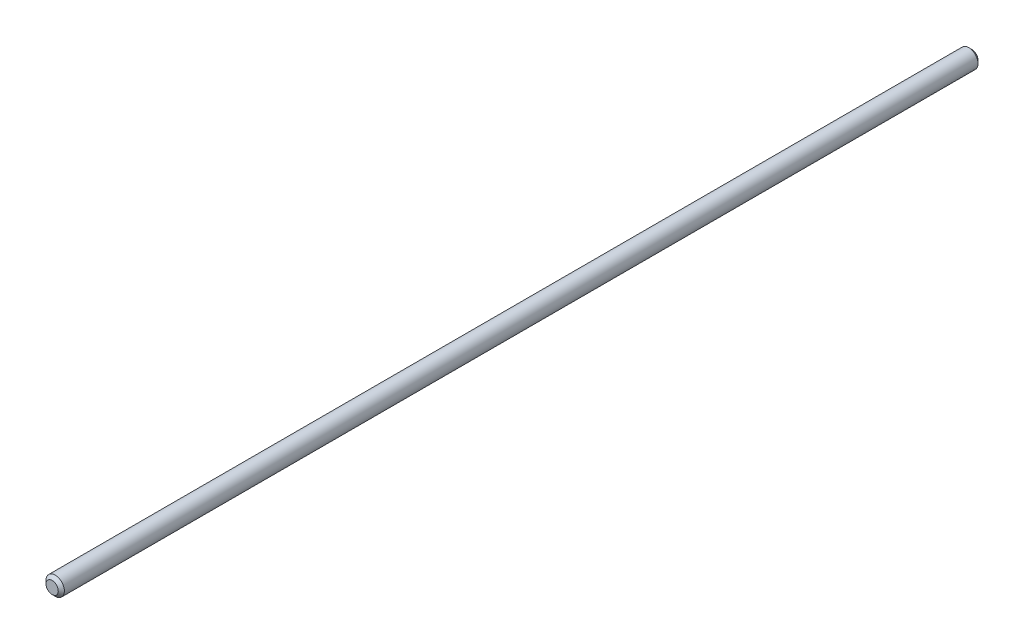
ISO-10303-21;
HEADER;
FILE_DESCRIPTION(('STEP AP214'),'2;1');
FILE_NAME('part.step','',(''),(''),'','','');
FILE_SCHEMA(('AUTOMOTIVE_DESIGN { 1 0 10303 214 1 1 1 1 }'));
ENDSEC;
DATA;
#1=APPLICATION_CONTEXT('core data for automotive mechanical design processes');
#2=APPLICATION_PROTOCOL_DEFINITION('international standard','automotive_design',2000,#1);
#3=PRODUCT_CONTEXT('',#1,'mechanical');
#4=PRODUCT('Part','Part','',(#3));
#5=PRODUCT_RELATED_PRODUCT_CATEGORY('part','',(#4));
#6=PRODUCT_DEFINITION_FORMATION('','',#4);
#7=PRODUCT_DEFINITION_CONTEXT('part definition',#1,'design');
#8=PRODUCT_DEFINITION('design','',#6,#7);
#9=PRODUCT_DEFINITION_SHAPE('','',#8);
#10=(LENGTH_UNIT() NAMED_UNIT(*) SI_UNIT(.MILLI.,.METRE.));
#11=(NAMED_UNIT(*) PLANE_ANGLE_UNIT() SI_UNIT($,.RADIAN.));
#12=(NAMED_UNIT(*) SI_UNIT($,.STERADIAN.) SOLID_ANGLE_UNIT());
#13=UNCERTAINTY_MEASURE_WITH_UNIT(LENGTH_MEASURE(1.E-05),#10,'distance_accuracy_value','');
#14=(GEOMETRIC_REPRESENTATION_CONTEXT(3) GLOBAL_UNCERTAINTY_ASSIGNED_CONTEXT((#13)) GLOBAL_UNIT_ASSIGNED_CONTEXT((#10,
#11,#12)) REPRESENTATION_CONTEXT('',''));
#15=CARTESIAN_POINT('',(0.,0.,0.));
#16=DIRECTION('',(0.,0.,1.));
#17=DIRECTION('',(1.,0.,0.));
#18=AXIS2_PLACEMENT_3D('',#15,#16,#17);
#19=CARTESIAN_POINT('',(0.,0.,150.));
#20=DIRECTION('',(0.,0.,-1.));
#21=DIRECTION('',(-1.,0.,0.));
#22=AXIS2_PLACEMENT_3D('',#19,#20,#21);
#23=CYLINDRICAL_SURFACE('',#22,1.5);
#24=CARTESIAN_POINT('',(0.,0.,0.5));
#25=DIRECTION('',(0.,0.,1.));
#26=DIRECTION('',(1.,0.,0.));
#27=AXIS2_PLACEMENT_3D('',#24,#25,#26);
#28=CIRCLE('',#27,1.5);
#29=CARTESIAN_POINT('',(1.5,0.,0.5));
#30=VERTEX_POINT('',#29);
#31=EDGE_CURVE('E56',#30,#30,#28,.T.);
#32=ORIENTED_EDGE('',*,*,#31,.T.);
#33=EDGE_LOOP('',(#32));
#34=FACE_BOUND('',#33,.T.);
#35=CARTESIAN_POINT('',(0.,0.,149.5));
#36=DIRECTION('',(0.,0.,1.));
#37=DIRECTION('',(1.,0.,0.));
#38=AXIS2_PLACEMENT_3D('',#35,#36,#37);
#39=CIRCLE('',#38,1.5);
#40=CARTESIAN_POINT('',(1.5,0.,149.5));
#41=VERTEX_POINT('',#40);
#42=EDGE_CURVE('E61',#41,#41,#39,.F.);
#43=ORIENTED_EDGE('',*,*,#42,.T.);
#44=EDGE_LOOP('',(#43));
#45=FACE_BOUND('',#44,.T.);
#46=ADVANCED_FACE('F42',(#34,#45),#23,.T.);
#47=CARTESIAN_POINT('',(0.,0.,150.));
#48=DIRECTION('',(0.,0.,1.));
#49=DIRECTION('',(1.,0.,0.));
#50=AXIS2_PLACEMENT_3D('',#47,#48,#49);
#51=PLANE('',#50);
#52=CARTESIAN_POINT('',(0.,0.,150.));
#53=DIRECTION('',(0.,0.,1.));
#54=DIRECTION('',(1.,0.,0.));
#55=AXIS2_PLACEMENT_3D('',#52,#53,#54);
#56=CIRCLE('',#55,1.00000000000003);
#57=CARTESIAN_POINT('',(1.00000000000003,0.,150.));
#58=VERTEX_POINT('',#57);
#59=EDGE_CURVE('E10',#58,#58,#56,.T.);
#60=ORIENTED_EDGE('',*,*,#59,.T.);
#61=EDGE_LOOP('',(#60));
#62=FACE_BOUND('',#61,.T.);
#63=ADVANCED_FACE('F78',(#62),#51,.T.);
#64=CARTESIAN_POINT('',(0.,0.,0.));
#65=DIRECTION('',(0.,0.,1.));
#66=DIRECTION('',(1.,0.,0.));
#67=AXIS2_PLACEMENT_3D('',#64,#65,#66);
#68=PLANE('',#67);
#69=CARTESIAN_POINT('',(0.,0.,0.));
#70=DIRECTION('',(0.,0.,1.));
#71=DIRECTION('',(1.,0.,0.));
#72=AXIS2_PLACEMENT_3D('',#69,#70,#71);
#73=CIRCLE('',#72,1.);
#74=CARTESIAN_POINT('',(1.,0.,0.));
#75=VERTEX_POINT('',#74);
#76=EDGE_CURVE('E51',#75,#75,#73,.F.);
#77=ORIENTED_EDGE('',*,*,#76,.T.);
#78=EDGE_LOOP('',(#77));
#79=FACE_BOUND('',#78,.T.);
#80=ADVANCED_FACE('F75',(#79),#68,.F.);
#81=CARTESIAN_POINT('',(0.,0.,0.5));
#82=DIRECTION('',(0.,0.,1.));
#83=DIRECTION('',(1.,0.,0.));
#84=AXIS2_PLACEMENT_3D('',#81,#82,#83);
#85=CONICAL_SURFACE('',#84,1.5,0.785398163397447);
#86=ORIENTED_EDGE('',*,*,#76,.F.);
#87=EDGE_LOOP('',(#86));
#88=FACE_BOUND('',#87,.T.);
#89=ORIENTED_EDGE('',*,*,#31,.F.);
#90=EDGE_LOOP('',(#89));
#91=FACE_BOUND('',#90,.T.);
#92=ADVANCED_FACE('F71',(#88,#91),#85,.T.);
#93=CARTESIAN_POINT('',(0.,0.,150.));
#94=DIRECTION('',(0.,0.,-1.));
#95=DIRECTION('',(-1.,0.,0.));
#96=AXIS2_PLACEMENT_3D('',#93,#94,#95);
#97=CONICAL_SURFACE('',#96,1.00000000000003,0.785398163397475);
#98=ORIENTED_EDGE('',*,*,#42,.F.);
#99=EDGE_LOOP('',(#98));
#100=FACE_BOUND('',#99,.T.);
#101=ORIENTED_EDGE('',*,*,#59,.F.);
#102=EDGE_LOOP('',(#101));
#103=FACE_BOUND('',#102,.T.);
#104=ADVANCED_FACE('F45',(#100,#103),#97,.T.);
#105=CLOSED_SHELL('',(#46,#63,#80,#92,#104));
#106=MANIFOLD_SOLID_BREP('B2',#105);
#107=ADVANCED_BREP_SHAPE_REPRESENTATION('',(#18,#106),#14);
#108=SHAPE_DEFINITION_REPRESENTATION(#9,#107);
ENDSEC;
END-ISO-10303-21;
